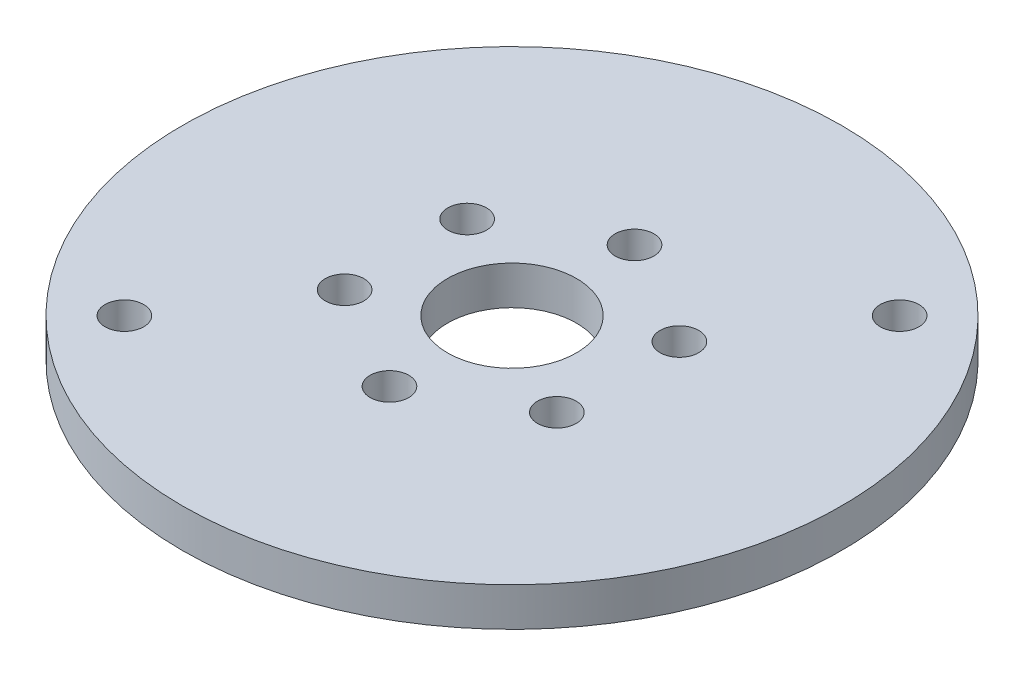
ISO-10303-21;
HEADER;
FILE_DESCRIPTION(('STEP AP214'),'2;1');
FILE_NAME('part.step','',(''),(''),'','','');
FILE_SCHEMA(('AUTOMOTIVE_DESIGN { 1 0 10303 214 1 1 1 1 }'));
ENDSEC;
DATA;
#1=APPLICATION_CONTEXT('core data for automotive mechanical design processes');
#2=APPLICATION_PROTOCOL_DEFINITION('international standard','automotive_design',2000,#1);
#3=PRODUCT_CONTEXT('',#1,'mechanical');
#4=PRODUCT('Part','Part','',(#3));
#5=PRODUCT_RELATED_PRODUCT_CATEGORY('part','',(#4));
#6=PRODUCT_DEFINITION_FORMATION('','',#4);
#7=PRODUCT_DEFINITION_CONTEXT('part definition',#1,'design');
#8=PRODUCT_DEFINITION('design','',#6,#7);
#9=PRODUCT_DEFINITION_SHAPE('','',#8);
#10=(LENGTH_UNIT() NAMED_UNIT(*) SI_UNIT(.MILLI.,.METRE.));
#11=(NAMED_UNIT(*) PLANE_ANGLE_UNIT() SI_UNIT($,.RADIAN.));
#12=(NAMED_UNIT(*) SI_UNIT($,.STERADIAN.) SOLID_ANGLE_UNIT());
#13=UNCERTAINTY_MEASURE_WITH_UNIT(LENGTH_MEASURE(1.E-05),#10,'distance_accuracy_value','');
#14=(GEOMETRIC_REPRESENTATION_CONTEXT(3) GLOBAL_UNCERTAINTY_ASSIGNED_CONTEXT((#13)) GLOBAL_UNIT_ASSIGNED_CONTEXT((#10,
#11,#12)) REPRESENTATION_CONTEXT('',''));
#15=CARTESIAN_POINT('',(0.,0.,0.));
#16=DIRECTION('',(0.,0.,1.));
#17=DIRECTION('',(1.,0.,0.));
#18=AXIS2_PLACEMENT_3D('',#15,#16,#17);
#19=CARTESIAN_POINT('',(0.,3.,0.));
#20=DIRECTION('',(0.,1.,0.));
#21=DIRECTION('',(0.,0.,1.));
#22=AXIS2_PLACEMENT_3D('',#19,#20,#21);
#23=PLANE('',#22);
#24=CARTESIAN_POINT('',(-8.2272413359514,3.,4.75000000000045));
#25=DIRECTION('',(0.,1.,0.));
#26=DIRECTION('',(0.,0.,1.));
#27=AXIS2_PLACEMENT_3D('',#24,#25,#26);
#28=CIRCLE('',#27,1.5);
#29=CARTESIAN_POINT('',(-8.2272413359514,3.,6.25000000000044));
#30=VERTEX_POINT('',#29);
#31=EDGE_CURVE('E87',#30,#30,#28,.T.);
#32=ORIENTED_EDGE('',*,*,#31,.F.);
#33=EDGE_LOOP('',(#32));
#34=FACE_BOUND('',#33,.T.);
#35=CARTESIAN_POINT('',(8.22724133595293,3.,4.74999999999956));
#36=DIRECTION('',(0.,1.,0.));
#37=DIRECTION('',(0.,0.,1.));
#38=AXIS2_PLACEMENT_3D('',#35,#36,#37);
#39=CIRCLE('',#38,1.5);
#40=CARTESIAN_POINT('',(8.22724133595293,3.,6.24999999999956));
#41=VERTEX_POINT('',#40);
#42=EDGE_CURVE('E75',#41,#41,#39,.T.);
#43=ORIENTED_EDGE('',*,*,#42,.F.);
#44=EDGE_LOOP('',(#43));
#45=FACE_BOUND('',#44,.T.);
#46=CARTESIAN_POINT('',(0.,3.,-9.5));
#47=DIRECTION('',(0.,1.,0.));
#48=DIRECTION('',(0.,0.,1.));
#49=AXIS2_PLACEMENT_3D('',#46,#47,#48);
#50=CIRCLE('',#49,1.5);
#51=CARTESIAN_POINT('',(0.,3.,-8.));
#52=VERTEX_POINT('',#51);
#53=EDGE_CURVE('E63',#52,#52,#50,.T.);
#54=ORIENTED_EDGE('',*,*,#53,.F.);
#55=EDGE_LOOP('',(#54));
#56=FACE_BOUND('',#55,.T.);
#57=CARTESIAN_POINT('',(-15.0260191002141,3.,15.0260191002142));
#58=DIRECTION('',(0.,1.,0.));
#59=DIRECTION('',(0.,0.,1.));
#60=AXIS2_PLACEMENT_3D('',#57,#58,#59);
#61=CIRCLE('',#60,1.5);
#62=CARTESIAN_POINT('',(-15.0260191002141,3.,16.5260191002142));
#63=VERTEX_POINT('',#62);
#64=EDGE_CURVE('E51',#63,#63,#61,.T.);
#65=ORIENTED_EDGE('',*,*,#64,.F.);
#66=EDGE_LOOP('',(#65));
#67=FACE_BOUND('',#66,.T.);
#68=CARTESIAN_POINT('',(0.,3.,0.));
#69=DIRECTION('',(0.,1.,0.));
#70=DIRECTION('',(0.,0.,1.));
#71=AXIS2_PLACEMENT_3D('',#68,#69,#70);
#72=CIRCLE('',#71,25.55);
#73=CARTESIAN_POINT('',(0.,3.,25.55));
#74=VERTEX_POINT('',#73);
#75=EDGE_CURVE('E10',#74,#74,#72,.T.);
#76=ORIENTED_EDGE('',*,*,#75,.T.);
#77=EDGE_LOOP('',(#76));
#78=FACE_BOUND('',#77,.T.);
#79=CARTESIAN_POINT('',(15.0260191002141,3.,-15.0260191002142));
#80=DIRECTION('',(0.,1.,0.));
#81=DIRECTION('',(0.,0.,1.));
#82=AXIS2_PLACEMENT_3D('',#79,#80,#81);
#83=CIRCLE('',#82,1.5);
#84=CARTESIAN_POINT('',(15.0260191002141,3.,-13.5260191002142));
#85=VERTEX_POINT('',#84);
#86=EDGE_CURVE('E46',#85,#85,#83,.T.);
#87=ORIENTED_EDGE('',*,*,#86,.F.);
#88=EDGE_LOOP('',(#87));
#89=FACE_BOUND('',#88,.T.);
#90=CARTESIAN_POINT('',(0.,3.,0.));
#91=DIRECTION('',(0.,1.,0.));
#92=DIRECTION('',(0.,0.,1.));
#93=AXIS2_PLACEMENT_3D('',#90,#91,#92);
#94=CIRCLE('',#93,5.);
#95=CARTESIAN_POINT('',(0.,3.,5.));
#96=VERTEX_POINT('',#95);
#97=EDGE_CURVE('E57',#96,#96,#94,.T.);
#98=ORIENTED_EDGE('',*,*,#97,.F.);
#99=EDGE_LOOP('',(#98));
#100=FACE_BOUND('',#99,.T.);
#101=CARTESIAN_POINT('',(8.22724133595242,3.,-4.75000000000044));
#102=DIRECTION('',(0.,1.,0.));
#103=DIRECTION('',(0.,0.,1.));
#104=AXIS2_PLACEMENT_3D('',#101,#102,#103);
#105=CIRCLE('',#104,1.5);
#106=CARTESIAN_POINT('',(8.22724133595242,3.,-3.25000000000045));
#107=VERTEX_POINT('',#106);
#108=EDGE_CURVE('E69',#107,#107,#105,.T.);
#109=ORIENTED_EDGE('',*,*,#108,.F.);
#110=EDGE_LOOP('',(#109));
#111=FACE_BOUND('',#110,.T.);
#112=CARTESIAN_POINT('',(1.02103840759604E-12,3.,9.5));
#113=DIRECTION('',(0.,1.,0.));
#114=DIRECTION('',(0.,0.,1.));
#115=AXIS2_PLACEMENT_3D('',#112,#113,#114);
#116=CIRCLE('',#115,1.5);
#117=CARTESIAN_POINT('',(1.02103840759604E-12,3.,11.));
#118=VERTEX_POINT('',#117);
#119=EDGE_CURVE('E81',#118,#118,#116,.T.);
#120=ORIENTED_EDGE('',*,*,#119,.F.);
#121=EDGE_LOOP('',(#120));
#122=FACE_BOUND('',#121,.T.);
#123=CARTESIAN_POINT('',(-8.22724133595191,3.,-4.74999999999955));
#124=DIRECTION('',(0.,1.,0.));
#125=DIRECTION('',(0.,0.,1.));
#126=AXIS2_PLACEMENT_3D('',#123,#124,#125);
#127=CIRCLE('',#126,1.5);
#128=CARTESIAN_POINT('',(-8.22724133595191,3.,-3.24999999999955));
#129=VERTEX_POINT('',#128);
#130=EDGE_CURVE('E93',#129,#129,#127,.T.);
#131=ORIENTED_EDGE('',*,*,#130,.F.);
#132=EDGE_LOOP('',(#131));
#133=FACE_BOUND('',#132,.T.);
#134=ADVANCED_FACE('F35',(#34,#45,#56,#67,#78,#89,#100,#111,#122,#133),#23,.T.);
#135=CARTESIAN_POINT('',(0.,0.,0.));
#136=DIRECTION('',(0.,1.,0.));
#137=DIRECTION('',(0.,0.,1.));
#138=AXIS2_PLACEMENT_3D('',#135,#136,#137);
#139=PLANE('',#138);
#140=CARTESIAN_POINT('',(0.,0.,0.));
#141=DIRECTION('',(0.,1.,0.));
#142=DIRECTION('',(0.,0.,1.));
#143=AXIS2_PLACEMENT_3D('',#140,#141,#142);
#144=CIRCLE('',#143,25.55);
#145=CARTESIAN_POINT('',(0.,0.,25.55));
#146=VERTEX_POINT('',#145);
#147=EDGE_CURVE('E39',#146,#146,#144,.T.);
#148=ORIENTED_EDGE('',*,*,#147,.F.);
#149=EDGE_LOOP('',(#148));
#150=FACE_BOUND('',#149,.T.);
#151=CARTESIAN_POINT('',(15.0260191002141,0.,-15.0260191002142));
#152=DIRECTION('',(0.,1.,0.));
#153=DIRECTION('',(0.,0.,1.));
#154=AXIS2_PLACEMENT_3D('',#151,#152,#153);
#155=CIRCLE('',#154,1.5);
#156=CARTESIAN_POINT('',(15.0260191002141,0.,-13.5260191002142));
#157=VERTEX_POINT('',#156);
#158=EDGE_CURVE('E48',#157,#157,#155,.T.);
#159=ORIENTED_EDGE('',*,*,#158,.T.);
#160=EDGE_LOOP('',(#159));
#161=FACE_BOUND('',#160,.T.);
#162=CARTESIAN_POINT('',(-15.0260191002141,0.,15.0260191002142));
#163=DIRECTION('',(0.,1.,0.));
#164=DIRECTION('',(0.,0.,1.));
#165=AXIS2_PLACEMENT_3D('',#162,#163,#164);
#166=CIRCLE('',#165,1.5);
#167=CARTESIAN_POINT('',(-15.0260191002141,0.,16.5260191002142));
#168=VERTEX_POINT('',#167);
#169=EDGE_CURVE('E54',#168,#168,#166,.T.);
#170=ORIENTED_EDGE('',*,*,#169,.T.);
#171=EDGE_LOOP('',(#170));
#172=FACE_BOUND('',#171,.T.);
#173=CARTESIAN_POINT('',(0.,0.,0.));
#174=DIRECTION('',(0.,1.,0.));
#175=DIRECTION('',(0.,0.,1.));
#176=AXIS2_PLACEMENT_3D('',#173,#174,#175);
#177=CIRCLE('',#176,5.);
#178=CARTESIAN_POINT('',(0.,0.,5.));
#179=VERTEX_POINT('',#178);
#180=EDGE_CURVE('E60',#179,#179,#177,.T.);
#181=ORIENTED_EDGE('',*,*,#180,.T.);
#182=EDGE_LOOP('',(#181));
#183=FACE_BOUND('',#182,.T.);
#184=CARTESIAN_POINT('',(0.,0.,-9.5));
#185=DIRECTION('',(0.,1.,0.));
#186=DIRECTION('',(0.,0.,1.));
#187=AXIS2_PLACEMENT_3D('',#184,#185,#186);
#188=CIRCLE('',#187,1.5);
#189=CARTESIAN_POINT('',(0.,0.,-8.));
#190=VERTEX_POINT('',#189);
#191=EDGE_CURVE('E66',#190,#190,#188,.T.);
#192=ORIENTED_EDGE('',*,*,#191,.T.);
#193=EDGE_LOOP('',(#192));
#194=FACE_BOUND('',#193,.T.);
#195=CARTESIAN_POINT('',(8.22724133595242,0.,-4.75000000000044));
#196=DIRECTION('',(0.,1.,0.));
#197=DIRECTION('',(0.,0.,1.));
#198=AXIS2_PLACEMENT_3D('',#195,#196,#197);
#199=CIRCLE('',#198,1.5);
#200=CARTESIAN_POINT('',(8.22724133595242,0.,-3.25000000000045));
#201=VERTEX_POINT('',#200);
#202=EDGE_CURVE('E72',#201,#201,#199,.T.);
#203=ORIENTED_EDGE('',*,*,#202,.T.);
#204=EDGE_LOOP('',(#203));
#205=FACE_BOUND('',#204,.T.);
#206=CARTESIAN_POINT('',(8.22724133595293,0.,4.74999999999956));
#207=DIRECTION('',(0.,1.,0.));
#208=DIRECTION('',(0.,0.,1.));
#209=AXIS2_PLACEMENT_3D('',#206,#207,#208);
#210=CIRCLE('',#209,1.5);
#211=CARTESIAN_POINT('',(8.22724133595293,0.,6.24999999999956));
#212=VERTEX_POINT('',#211);
#213=EDGE_CURVE('E78',#212,#212,#210,.T.);
#214=ORIENTED_EDGE('',*,*,#213,.T.);
#215=EDGE_LOOP('',(#214));
#216=FACE_BOUND('',#215,.T.);
#217=CARTESIAN_POINT('',(1.02103840759604E-12,0.,9.5));
#218=DIRECTION('',(0.,1.,0.));
#219=DIRECTION('',(0.,0.,1.));
#220=AXIS2_PLACEMENT_3D('',#217,#218,#219);
#221=CIRCLE('',#220,1.5);
#222=CARTESIAN_POINT('',(1.02103840759604E-12,0.,11.));
#223=VERTEX_POINT('',#222);
#224=EDGE_CURVE('E84',#223,#223,#221,.T.);
#225=ORIENTED_EDGE('',*,*,#224,.T.);
#226=EDGE_LOOP('',(#225));
#227=FACE_BOUND('',#226,.T.);
#228=CARTESIAN_POINT('',(-8.2272413359514,0.,4.75000000000045));
#229=DIRECTION('',(0.,1.,0.));
#230=DIRECTION('',(0.,0.,1.));
#231=AXIS2_PLACEMENT_3D('',#228,#229,#230);
#232=CIRCLE('',#231,1.5);
#233=CARTESIAN_POINT('',(-8.2272413359514,0.,6.25000000000044));
#234=VERTEX_POINT('',#233);
#235=EDGE_CURVE('E90',#234,#234,#232,.T.);
#236=ORIENTED_EDGE('',*,*,#235,.T.);
#237=EDGE_LOOP('',(#236));
#238=FACE_BOUND('',#237,.T.);
#239=CARTESIAN_POINT('',(-8.22724133595191,0.,-4.74999999999955));
#240=DIRECTION('',(0.,1.,0.));
#241=DIRECTION('',(0.,0.,1.));
#242=AXIS2_PLACEMENT_3D('',#239,#240,#241);
#243=CIRCLE('',#242,1.5);
#244=CARTESIAN_POINT('',(-8.22724133595191,0.,-3.24999999999955));
#245=VERTEX_POINT('',#244);
#246=EDGE_CURVE('E96',#245,#245,#243,.T.);
#247=ORIENTED_EDGE('',*,*,#246,.T.);
#248=EDGE_LOOP('',(#247));
#249=FACE_BOUND('',#248,.T.);
#250=ADVANCED_FACE('F106',(#150,#161,#172,#183,#194,#205,#216,#227,#238,#249),#139,.F.);
#251=CARTESIAN_POINT('',(0.,3.,0.));
#252=DIRECTION('',(0.,-1.,0.));
#253=DIRECTION('',(0.,0.,-1.));
#254=AXIS2_PLACEMENT_3D('',#251,#252,#253);
#255=CYLINDRICAL_SURFACE('',#254,25.55);
#256=ORIENTED_EDGE('',*,*,#75,.F.);
#257=EDGE_LOOP('',(#256));
#258=FACE_BOUND('',#257,.T.);
#259=ORIENTED_EDGE('',*,*,#147,.T.);
#260=EDGE_LOOP('',(#259));
#261=FACE_BOUND('',#260,.T.);
#262=ADVANCED_FACE('F37',(#258,#261),#255,.T.);
#263=CARTESIAN_POINT('',(15.0260191002141,3.,-15.0260191002142));
#264=DIRECTION('',(0.,-1.,0.));
#265=DIRECTION('',(0.,0.,-1.));
#266=AXIS2_PLACEMENT_3D('',#263,#264,#265);
#267=CYLINDRICAL_SURFACE('',#266,1.5);
#268=ORIENTED_EDGE('',*,*,#86,.T.);
#269=EDGE_LOOP('',(#268));
#270=FACE_BOUND('',#269,.T.);
#271=ORIENTED_EDGE('',*,*,#158,.F.);
#272=EDGE_LOOP('',(#271));
#273=FACE_BOUND('',#272,.T.);
#274=ADVANCED_FACE('F116',(#270,#273),#267,.F.);
#275=CARTESIAN_POINT('',(-15.0260191002141,3.,15.0260191002142));
#276=DIRECTION('',(0.,-1.,0.));
#277=DIRECTION('',(0.,0.,-1.));
#278=AXIS2_PLACEMENT_3D('',#275,#276,#277);
#279=CYLINDRICAL_SURFACE('',#278,1.5);
#280=ORIENTED_EDGE('',*,*,#64,.T.);
#281=EDGE_LOOP('',(#280));
#282=FACE_BOUND('',#281,.T.);
#283=ORIENTED_EDGE('',*,*,#169,.F.);
#284=EDGE_LOOP('',(#283));
#285=FACE_BOUND('',#284,.T.);
#286=ADVANCED_FACE('F119',(#282,#285),#279,.F.);
#287=CARTESIAN_POINT('',(0.,3.,0.));
#288=DIRECTION('',(0.,-1.,0.));
#289=DIRECTION('',(0.,0.,-1.));
#290=AXIS2_PLACEMENT_3D('',#287,#288,#289);
#291=CYLINDRICAL_SURFACE('',#290,5.);
#292=ORIENTED_EDGE('',*,*,#97,.T.);
#293=EDGE_LOOP('',(#292));
#294=FACE_BOUND('',#293,.T.);
#295=ORIENTED_EDGE('',*,*,#180,.F.);
#296=EDGE_LOOP('',(#295));
#297=FACE_BOUND('',#296,.T.);
#298=ADVANCED_FACE('F123',(#294,#297),#291,.F.);
#299=CARTESIAN_POINT('',(0.,3.,-9.5));
#300=DIRECTION('',(0.,-1.,0.));
#301=DIRECTION('',(0.,0.,-1.));
#302=AXIS2_PLACEMENT_3D('',#299,#300,#301);
#303=CYLINDRICAL_SURFACE('',#302,1.5);
#304=ORIENTED_EDGE('',*,*,#53,.T.);
#305=EDGE_LOOP('',(#304));
#306=FACE_BOUND('',#305,.T.);
#307=ORIENTED_EDGE('',*,*,#191,.F.);
#308=EDGE_LOOP('',(#307));
#309=FACE_BOUND('',#308,.T.);
#310=ADVANCED_FACE('F127',(#306,#309),#303,.F.);
#311=CARTESIAN_POINT('',(8.22724133595242,3.,-4.75000000000044));
#312=DIRECTION('',(0.,-1.,0.));
#313=DIRECTION('',(0.,0.,-1.));
#314=AXIS2_PLACEMENT_3D('',#311,#312,#313);
#315=CYLINDRICAL_SURFACE('',#314,1.5);
#316=ORIENTED_EDGE('',*,*,#108,.T.);
#317=EDGE_LOOP('',(#316));
#318=FACE_BOUND('',#317,.T.);
#319=ORIENTED_EDGE('',*,*,#202,.F.);
#320=EDGE_LOOP('',(#319));
#321=FACE_BOUND('',#320,.T.);
#322=ADVANCED_FACE('F131',(#318,#321),#315,.F.);
#323=CARTESIAN_POINT('',(8.22724133595293,3.,4.74999999999956));
#324=DIRECTION('',(0.,-1.,0.));
#325=DIRECTION('',(0.,0.,-1.));
#326=AXIS2_PLACEMENT_3D('',#323,#324,#325);
#327=CYLINDRICAL_SURFACE('',#326,1.5);
#328=ORIENTED_EDGE('',*,*,#42,.T.);
#329=EDGE_LOOP('',(#328));
#330=FACE_BOUND('',#329,.T.);
#331=ORIENTED_EDGE('',*,*,#213,.F.);
#332=EDGE_LOOP('',(#331));
#333=FACE_BOUND('',#332,.T.);
#334=ADVANCED_FACE('F135',(#330,#333),#327,.F.);
#335=CARTESIAN_POINT('',(1.02103840759604E-12,3.,9.5));
#336=DIRECTION('',(0.,-1.,0.));
#337=DIRECTION('',(0.,0.,-1.));
#338=AXIS2_PLACEMENT_3D('',#335,#336,#337);
#339=CYLINDRICAL_SURFACE('',#338,1.5);
#340=ORIENTED_EDGE('',*,*,#119,.T.);
#341=EDGE_LOOP('',(#340));
#342=FACE_BOUND('',#341,.T.);
#343=ORIENTED_EDGE('',*,*,#224,.F.);
#344=EDGE_LOOP('',(#343));
#345=FACE_BOUND('',#344,.T.);
#346=ADVANCED_FACE('F139',(#342,#345),#339,.F.);
#347=CARTESIAN_POINT('',(-8.2272413359514,3.,4.75000000000045));
#348=DIRECTION('',(0.,-1.,0.));
#349=DIRECTION('',(0.,0.,-1.));
#350=AXIS2_PLACEMENT_3D('',#347,#348,#349);
#351=CYLINDRICAL_SURFACE('',#350,1.5);
#352=ORIENTED_EDGE('',*,*,#31,.T.);
#353=EDGE_LOOP('',(#352));
#354=FACE_BOUND('',#353,.T.);
#355=ORIENTED_EDGE('',*,*,#235,.F.);
#356=EDGE_LOOP('',(#355));
#357=FACE_BOUND('',#356,.T.);
#358=ADVANCED_FACE('F143',(#354,#357),#351,.F.);
#359=CARTESIAN_POINT('',(-8.22724133595191,3.,-4.74999999999955));
#360=DIRECTION('',(0.,-1.,0.));
#361=DIRECTION('',(0.,0.,-1.));
#362=AXIS2_PLACEMENT_3D('',#359,#360,#361);
#363=CYLINDRICAL_SURFACE('',#362,1.5);
#364=ORIENTED_EDGE('',*,*,#130,.T.);
#365=EDGE_LOOP('',(#364));
#366=FACE_BOUND('',#365,.T.);
#367=ORIENTED_EDGE('',*,*,#246,.F.);
#368=EDGE_LOOP('',(#367));
#369=FACE_BOUND('',#368,.T.);
#370=ADVANCED_FACE('F102',(#366,#369),#363,.F.);
#371=CLOSED_SHELL('',(#134,#250,#262,#274,#286,#298,#310,#322,#334,#346,#358,#370));
#372=MANIFOLD_SOLID_BREP('B2',#371);
#373=ADVANCED_BREP_SHAPE_REPRESENTATION('',(#18,#372),#14);
#374=SHAPE_DEFINITION_REPRESENTATION(#9,#373);
ENDSEC;
END-ISO-10303-21;
